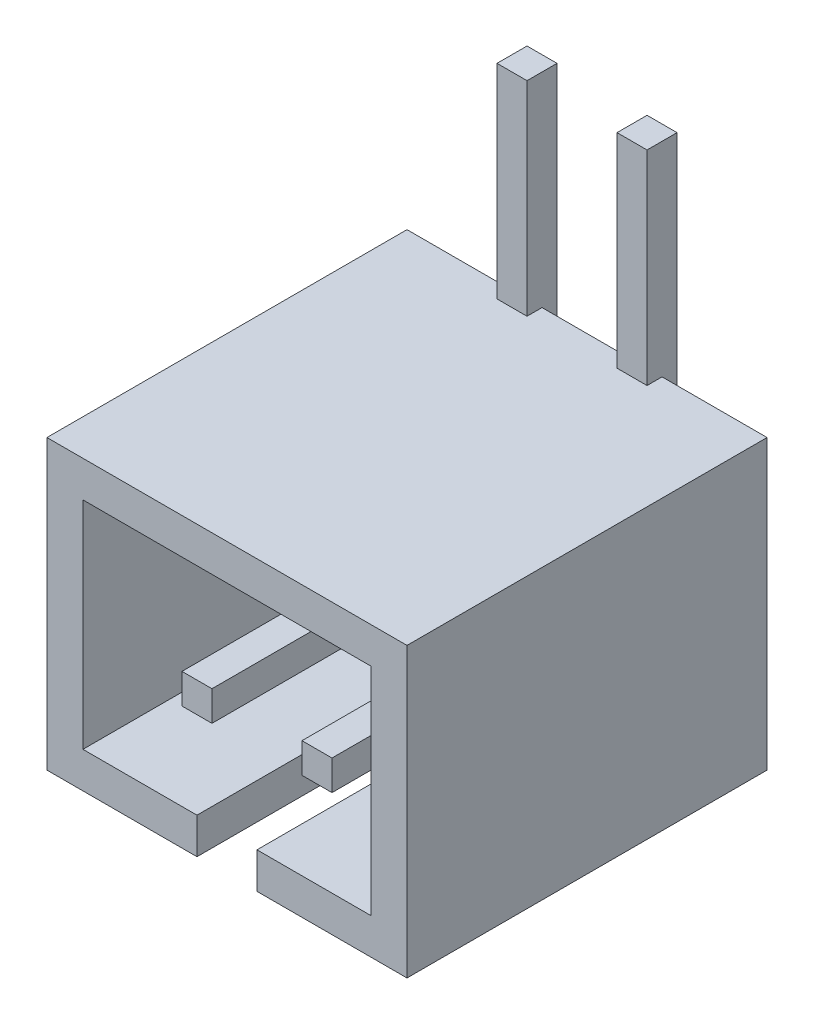
ISO-10303-21;
HEADER;
FILE_DESCRIPTION(('STEP AP214'),'2;1');
FILE_NAME('part.step','',(''),(''),'','','');
FILE_SCHEMA(('AUTOMOTIVE_DESIGN { 1 0 10303 214 1 1 1 1 }'));
ENDSEC;
DATA;
#1=APPLICATION_CONTEXT('core data for automotive mechanical design processes');
#2=APPLICATION_PROTOCOL_DEFINITION('international standard','automotive_design',2000,#1);
#3=PRODUCT_CONTEXT('',#1,'mechanical');
#4=PRODUCT('Part','Part','',(#3));
#5=PRODUCT_RELATED_PRODUCT_CATEGORY('part','',(#4));
#6=PRODUCT_DEFINITION_FORMATION('','',#4);
#7=PRODUCT_DEFINITION_CONTEXT('part definition',#1,'design');
#8=PRODUCT_DEFINITION('design','',#6,#7);
#9=PRODUCT_DEFINITION_SHAPE('','',#8);
#10=(LENGTH_UNIT() NAMED_UNIT(*) SI_UNIT(.MILLI.,.METRE.));
#11=(NAMED_UNIT(*) PLANE_ANGLE_UNIT() SI_UNIT($,.RADIAN.));
#12=(NAMED_UNIT(*) SI_UNIT($,.STERADIAN.) SOLID_ANGLE_UNIT());
#13=UNCERTAINTY_MEASURE_WITH_UNIT(LENGTH_MEASURE(1.E-05),#10,'distance_accuracy_value','');
#14=(GEOMETRIC_REPRESENTATION_CONTEXT(3) GLOBAL_UNCERTAINTY_ASSIGNED_CONTEXT((#13)) GLOBAL_UNIT_ASSIGNED_CONTEXT((#10,
#11,#12)) REPRESENTATION_CONTEXT('',''));
#15=CARTESIAN_POINT('',(0.,0.,0.));
#16=DIRECTION('',(0.,0.,1.));
#17=DIRECTION('',(1.,0.,0.));
#18=AXIS2_PLACEMENT_3D('',#15,#16,#17);
#19=CARTESIAN_POINT('',(-3.,2.4,2.));
#20=DIRECTION('',(0.,-1.,0.));
#21=DIRECTION('',(0.,0.,-1.));
#22=AXIS2_PLACEMENT_3D('',#19,#20,#21);
#23=PLANE('',#22);
#24=DIRECTION('',(0.,0.,1.));
#25=VECTOR('',#24,1.);
#26=CARTESIAN_POINT('',(0.75,2.4,2.));
#27=LINE('',#26,#25);
#28=CARTESIAN_POINT('',(0.75,2.4,0.));
#29=VERTEX_POINT('',#28);
#30=CARTESIAN_POINT('',(0.75,2.4,0.25));
#31=VERTEX_POINT('',#30);
#32=EDGE_CURVE('E292',#29,#31,#27,.T.);
#33=ORIENTED_EDGE('',*,*,#32,.F.);
#34=DIRECTION('',(-1.,0.,0.));
#35=VECTOR('',#34,1.);
#36=CARTESIAN_POINT('',(-3.,2.4,0.));
#37=LINE('',#36,#35);
#38=CARTESIAN_POINT('',(-0.75,2.4,0.));
#39=VERTEX_POINT('',#38);
#40=EDGE_CURVE('E502',#29,#39,#37,.T.);
#41=ORIENTED_EDGE('',*,*,#40,.T.);
#42=DIRECTION('',(0.,0.,1.));
#43=VECTOR('',#42,1.);
#44=CARTESIAN_POINT('',(-0.75,2.4,2.));
#45=LINE('',#44,#43);
#46=CARTESIAN_POINT('',(-0.75,2.4,0.25));
#47=VERTEX_POINT('',#46);
#48=EDGE_CURVE('E362',#39,#47,#45,.T.);
#49=ORIENTED_EDGE('',*,*,#48,.T.);
#50=DIRECTION('',(1.,0.,0.));
#51=VECTOR('',#50,1.);
#52=CARTESIAN_POINT('',(-3.,2.4,0.25));
#53=LINE('',#52,#51);
#54=CARTESIAN_POINT('',(-1.25,2.4,0.25));
#55=VERTEX_POINT('',#54);
#56=EDGE_CURVE('E535',#55,#47,#53,.T.);
#57=ORIENTED_EDGE('',*,*,#56,.F.);
#58=DIRECTION('',(0.,0.,1.));
#59=VECTOR('',#58,1.);
#60=CARTESIAN_POINT('',(-1.25,2.4,2.));
#61=LINE('',#60,#59);
#62=CARTESIAN_POINT('',(-1.25,2.4,0.));
#63=VERTEX_POINT('',#62);
#64=EDGE_CURVE('E370',#63,#55,#61,.T.);
#65=ORIENTED_EDGE('',*,*,#64,.F.);
#66=CARTESIAN_POINT('',(-3.,2.4,0.));
#67=VERTEX_POINT('',#66);
#68=EDGE_CURVE('E496',#63,#67,#37,.T.);
#69=ORIENTED_EDGE('',*,*,#68,.T.);
#70=DIRECTION('',(0.,0.,-1.));
#71=VECTOR('',#70,1.);
#72=CARTESIAN_POINT('',(-3.,2.4,2.));
#73=LINE('',#72,#71);
#74=CARTESIAN_POINT('',(-3.,2.4,6.));
#75=VERTEX_POINT('',#74);
#76=EDGE_CURVE('E514',#75,#67,#73,.T.);
#77=ORIENTED_EDGE('',*,*,#76,.F.);
#78=DIRECTION('',(-1.,0.,0.));
#79=VECTOR('',#78,1.);
#80=CARTESIAN_POINT('',(-3.,2.4,6.));
#81=LINE('',#80,#79);
#82=CARTESIAN_POINT('',(3.,2.4,6.));
#83=VERTEX_POINT('',#82);
#84=EDGE_CURVE('E415',#83,#75,#81,.T.);
#85=ORIENTED_EDGE('',*,*,#84,.F.);
#86=DIRECTION('',(0.,0.,-1.));
#87=VECTOR('',#86,1.);
#88=CARTESIAN_POINT('',(3.,2.4,2.));
#89=LINE('',#88,#87);
#90=CARTESIAN_POINT('',(3.,2.4,0.));
#91=VERTEX_POINT('',#90);
#92=EDGE_CURVE('E518',#83,#91,#89,.T.);
#93=ORIENTED_EDGE('',*,*,#92,.T.);
#94=CARTESIAN_POINT('',(1.25,2.4,0.));
#95=VERTEX_POINT('',#94);
#96=EDGE_CURVE('E497',#91,#95,#37,.T.);
#97=ORIENTED_EDGE('',*,*,#96,.T.);
#98=DIRECTION('',(0.,0.,1.));
#99=VECTOR('',#98,1.);
#100=CARTESIAN_POINT('',(1.25,2.4,2.));
#101=LINE('',#100,#99);
#102=CARTESIAN_POINT('',(1.25,2.4,0.25));
#103=VERTEX_POINT('',#102);
#104=EDGE_CURVE('E277',#95,#103,#101,.T.);
#105=ORIENTED_EDGE('',*,*,#104,.T.);
#106=DIRECTION('',(1.,0.,0.));
#107=VECTOR('',#106,1.);
#108=CARTESIAN_POINT('',(-3.,2.4,0.25));
#109=LINE('',#108,#107);
#110=EDGE_CURVE('E12',#31,#103,#109,.T.);
#111=ORIENTED_EDGE('',*,*,#110,.F.);
#112=EDGE_LOOP('',(#33,#41,#49,#57,#65,#69,#77,#85,#93,#97,#105,#111));
#113=FACE_BOUND('',#112,.T.);
#114=ADVANCED_FACE('F41',(#113),#23,.F.);
#115=CARTESIAN_POINT('',(0.,0.,2.));
#116=DIRECTION('',(0.,0.,1.));
#117=DIRECTION('',(1.,0.,0.));
#118=AXIS2_PLACEMENT_3D('',#115,#116,#117);
#119=PLANE('',#118);
#120=DIRECTION('',(0.,-1.,0.));
#121=VECTOR('',#120,1.);
#122=CARTESIAN_POINT('',(0.500000000000001,-2.4,2.));
#123=LINE('',#122,#121);
#124=CARTESIAN_POINT('',(0.500000000000001,-1.8,2.));
#125=VERTEX_POINT('',#124);
#126=CARTESIAN_POINT('',(0.500000000000001,-2.4,2.));
#127=VERTEX_POINT('',#126);
#128=EDGE_CURVE('E380',#125,#127,#123,.T.);
#129=ORIENTED_EDGE('',*,*,#128,.F.);
#130=DIRECTION('',(-1.,0.,0.));
#131=VECTOR('',#130,1.);
#132=CARTESIAN_POINT('',(0.500000000000001,-1.8,2.));
#133=LINE('',#132,#131);
#134=CARTESIAN_POINT('',(2.4,-1.8,2.));
#135=VERTEX_POINT('',#134);
#136=EDGE_CURVE('E386',#135,#125,#133,.T.);
#137=ORIENTED_EDGE('',*,*,#136,.F.);
#138=DIRECTION('',(0.,-1.,0.));
#139=VECTOR('',#138,1.);
#140=CARTESIAN_POINT('',(2.4,-1.8,2.));
#141=LINE('',#140,#139);
#142=CARTESIAN_POINT('',(2.4,1.8,2.));
#143=VERTEX_POINT('',#142);
#144=EDGE_CURVE('E391',#143,#135,#141,.T.);
#145=ORIENTED_EDGE('',*,*,#144,.F.);
#146=DIRECTION('',(1.,0.,0.));
#147=VECTOR('',#146,1.);
#148=CARTESIAN_POINT('',(-2.4,1.8,2.));
#149=LINE('',#148,#147);
#150=CARTESIAN_POINT('',(-2.4,1.8,2.));
#151=VERTEX_POINT('',#150);
#152=EDGE_CURVE('E396',#151,#143,#149,.T.);
#153=ORIENTED_EDGE('',*,*,#152,.F.);
#154=DIRECTION('',(0.,1.,0.));
#155=VECTOR('',#154,1.);
#156=CARTESIAN_POINT('',(-2.4,-1.8,2.));
#157=LINE('',#156,#155);
#158=CARTESIAN_POINT('',(-2.4,-1.8,2.));
#159=VERTEX_POINT('',#158);
#160=EDGE_CURVE('E401',#159,#151,#157,.T.);
#161=ORIENTED_EDGE('',*,*,#160,.F.);
#162=DIRECTION('',(-1.,0.,0.));
#163=VECTOR('',#162,1.);
#164=CARTESIAN_POINT('',(-0.5,-1.8,2.));
#165=LINE('',#164,#163);
#166=CARTESIAN_POINT('',(-0.5,-1.8,2.));
#167=VERTEX_POINT('',#166);
#168=EDGE_CURVE('E406',#167,#159,#165,.T.);
#169=ORIENTED_EDGE('',*,*,#168,.F.);
#170=DIRECTION('',(0.,1.,0.));
#171=VECTOR('',#170,1.);
#172=CARTESIAN_POINT('',(-0.5,-2.4,2.));
#173=LINE('',#172,#171);
#174=CARTESIAN_POINT('',(-0.5,-2.4,2.));
#175=VERTEX_POINT('',#174);
#176=EDGE_CURVE('E411',#175,#167,#173,.T.);
#177=ORIENTED_EDGE('',*,*,#176,.F.);
#178=DIRECTION('',(1.,0.,0.));
#179=VECTOR('',#178,1.);
#180=CARTESIAN_POINT('',(-3.,-2.4,2.));
#181=LINE('',#180,#179);
#182=EDGE_CURVE('E488',#175,#127,#181,.T.);
#183=ORIENTED_EDGE('',*,*,#182,.T.);
#184=EDGE_LOOP('',(#129,#137,#145,#153,#161,#169,#177,#183));
#185=FACE_BOUND('',#184,.T.);
#186=DIRECTION('',(-1.,0.,0.));
#187=VECTOR('',#186,1.);
#188=CARTESIAN_POINT('',(0.,-0.85,2.));
#189=LINE('',#188,#187);
#190=CARTESIAN_POINT('',(-0.75,-0.850000000000001,2.));
#191=VERTEX_POINT('',#190);
#192=CARTESIAN_POINT('',(-1.25,-0.850000000000001,2.));
#193=VERTEX_POINT('',#192);
#194=EDGE_CURVE('E376',#191,#193,#189,.T.);
#195=ORIENTED_EDGE('',*,*,#194,.T.);
#196=DIRECTION('',(0.,1.,0.));
#197=VECTOR('',#196,1.);
#198=CARTESIAN_POINT('',(-1.25,0.,2.));
#199=LINE('',#198,#197);
#200=CARTESIAN_POINT('',(-1.25,-0.349999999999999,2.));
#201=VERTEX_POINT('',#200);
#202=EDGE_CURVE('E373',#193,#201,#199,.T.);
#203=ORIENTED_EDGE('',*,*,#202,.T.);
#204=DIRECTION('',(1.,0.,0.));
#205=VECTOR('',#204,1.);
#206=CARTESIAN_POINT('',(0.,-0.349999999999999,2.));
#207=LINE('',#206,#205);
#208=CARTESIAN_POINT('',(-0.75,-0.349999999999999,2.));
#209=VERTEX_POINT('',#208);
#210=EDGE_CURVE('E532',#201,#209,#207,.T.);
#211=ORIENTED_EDGE('',*,*,#210,.T.);
#212=DIRECTION('',(0.,1.,0.));
#213=VECTOR('',#212,1.);
#214=CARTESIAN_POINT('',(-0.75,0.,2.));
#215=LINE('',#214,#213);
#216=EDGE_CURVE('E366',#191,#209,#215,.T.);
#217=ORIENTED_EDGE('',*,*,#216,.F.);
#218=EDGE_LOOP('',(#195,#203,#211,#217));
#219=FACE_BOUND('',#218,.T.);
#220=DIRECTION('',(-1.,0.,0.));
#221=VECTOR('',#220,1.);
#222=CARTESIAN_POINT('',(0.,-0.850000000000001,2.));
#223=LINE('',#222,#221);
#224=CARTESIAN_POINT('',(1.25,-0.850000000000001,2.));
#225=VERTEX_POINT('',#224);
#226=CARTESIAN_POINT('',(0.75,-0.850000000000001,2.));
#227=VERTEX_POINT('',#226);
#228=EDGE_CURVE('E57',#225,#227,#223,.T.);
#229=ORIENTED_EDGE('',*,*,#228,.T.);
#230=DIRECTION('',(0.,1.,0.));
#231=VECTOR('',#230,1.);
#232=CARTESIAN_POINT('',(0.75,0.,2.));
#233=LINE('',#232,#231);
#234=CARTESIAN_POINT('',(0.75,-0.349999999999999,2.));
#235=VERTEX_POINT('',#234);
#236=EDGE_CURVE('E61',#227,#235,#233,.T.);
#237=ORIENTED_EDGE('',*,*,#236,.T.);
#238=DIRECTION('',(1.,0.,0.));
#239=VECTOR('',#238,1.);
#240=CARTESIAN_POINT('',(0.,-0.349999999999999,2.));
#241=LINE('',#240,#239);
#242=CARTESIAN_POINT('',(1.25,-0.349999999999999,2.));
#243=VERTEX_POINT('',#242);
#244=EDGE_CURVE('E50',#235,#243,#241,.T.);
#245=ORIENTED_EDGE('',*,*,#244,.T.);
#246=DIRECTION('',(0.,1.,0.));
#247=VECTOR('',#246,1.);
#248=CARTESIAN_POINT('',(1.25,0.,2.));
#249=LINE('',#248,#247);
#250=EDGE_CURVE('E282',#225,#243,#249,.T.);
#251=ORIENTED_EDGE('',*,*,#250,.F.);
#252=EDGE_LOOP('',(#229,#237,#245,#251));
#253=FACE_BOUND('',#252,.T.);
#254=ADVANCED_FACE('F548',(#185,#219,#253),#119,.T.);
#255=CARTESIAN_POINT('',(0.,0.,0.));
#256=DIRECTION('',(0.,0.,1.));
#257=DIRECTION('',(1.,0.,0.));
#258=AXIS2_PLACEMENT_3D('',#255,#256,#257);
#259=PLANE('',#258);
#260=DIRECTION('',(0.,1.,0.));
#261=VECTOR('',#260,1.);
#262=CARTESIAN_POINT('',(0.75,0.,0.));
#263=LINE('',#262,#261);
#264=CARTESIAN_POINT('',(0.75,-0.850000000000001,0.));
#265=VERTEX_POINT('',#264);
#266=EDGE_CURVE('E545',#265,#29,#263,.T.);
#267=ORIENTED_EDGE('',*,*,#266,.F.);
#268=DIRECTION('',(-1.,0.,0.));
#269=VECTOR('',#268,1.);
#270=CARTESIAN_POINT('',(0.,-0.850000000000001,0.));
#271=LINE('',#270,#269);
#272=CARTESIAN_POINT('',(1.25,-0.850000000000001,0.));
#273=VERTEX_POINT('',#272);
#274=EDGE_CURVE('E542',#273,#265,#271,.T.);
#275=ORIENTED_EDGE('',*,*,#274,.F.);
#276=DIRECTION('',(0.,1.,0.));
#277=VECTOR('',#276,1.);
#278=CARTESIAN_POINT('',(1.25,0.,0.));
#279=LINE('',#278,#277);
#280=EDGE_CURVE('E538',#273,#95,#279,.T.);
#281=ORIENTED_EDGE('',*,*,#280,.T.);
#282=ORIENTED_EDGE('',*,*,#96,.F.);
#283=DIRECTION('',(0.,1.,0.));
#284=VECTOR('',#283,1.);
#285=CARTESIAN_POINT('',(3.,2.4,0.));
#286=LINE('',#285,#284);
#287=CARTESIAN_POINT('',(3.,-2.4,0.));
#288=VERTEX_POINT('',#287);
#289=EDGE_CURVE('E419',#288,#91,#286,.T.);
#290=ORIENTED_EDGE('',*,*,#289,.F.);
#291=DIRECTION('',(1.,0.,0.));
#292=VECTOR('',#291,1.);
#293=CARTESIAN_POINT('',(-3.,-2.4,0.));
#294=LINE('',#293,#292);
#295=CARTESIAN_POINT('',(-3.,-2.4,0.));
#296=VERTEX_POINT('',#295);
#297=EDGE_CURVE('E492',#296,#288,#294,.T.);
#298=ORIENTED_EDGE('',*,*,#297,.F.);
#299=DIRECTION('',(0.,-1.,0.));
#300=VECTOR('',#299,1.);
#301=CARTESIAN_POINT('',(-3.,2.4,0.));
#302=LINE('',#301,#300);
#303=EDGE_CURVE('E501',#67,#296,#302,.T.);
#304=ORIENTED_EDGE('',*,*,#303,.F.);
#305=ORIENTED_EDGE('',*,*,#68,.F.);
#306=DIRECTION('',(0.,1.,0.));
#307=VECTOR('',#306,1.);
#308=CARTESIAN_POINT('',(-1.25,0.,0.));
#309=LINE('',#308,#307);
#310=CARTESIAN_POINT('',(-1.25,-0.850000000000001,0.));
#311=VERTEX_POINT('',#310);
#312=EDGE_CURVE('E529',#311,#63,#309,.T.);
#313=ORIENTED_EDGE('',*,*,#312,.F.);
#314=DIRECTION('',(-1.,0.,0.));
#315=VECTOR('',#314,1.);
#316=CARTESIAN_POINT('',(0.,-0.850000000000001,0.));
#317=LINE('',#316,#315);
#318=CARTESIAN_POINT('',(-0.75,-0.850000000000001,0.));
#319=VERTEX_POINT('',#318);
#320=EDGE_CURVE('E526',#319,#311,#317,.T.);
#321=ORIENTED_EDGE('',*,*,#320,.F.);
#322=DIRECTION('',(0.,1.,0.));
#323=VECTOR('',#322,1.);
#324=CARTESIAN_POINT('',(-0.75,0.,0.));
#325=LINE('',#324,#323);
#326=EDGE_CURVE('E522',#319,#39,#325,.T.);
#327=ORIENTED_EDGE('',*,*,#326,.T.);
#328=ORIENTED_EDGE('',*,*,#40,.F.);
#329=EDGE_LOOP('',(#267,#275,#281,#282,#290,#298,#304,#305,#313,#321,#327,#328));
#330=FACE_BOUND('',#329,.T.);
#331=ADVANCED_FACE('F626',(#330),#259,.F.);
#332=CARTESIAN_POINT('',(3.,2.4,2.));
#333=DIRECTION('',(-1.,0.,0.));
#334=DIRECTION('',(0.,-1.,0.));
#335=AXIS2_PLACEMENT_3D('',#332,#333,#334);
#336=PLANE('',#335);
#337=ORIENTED_EDGE('',*,*,#289,.T.);
#338=ORIENTED_EDGE('',*,*,#92,.F.);
#339=DIRECTION('',(0.,1.,0.));
#340=VECTOR('',#339,1.);
#341=CARTESIAN_POINT('',(3.,-2.4,6.));
#342=LINE('',#341,#340);
#343=CARTESIAN_POINT('',(3.,-2.4,6.));
#344=VERTEX_POINT('',#343);
#345=EDGE_CURVE('E420',#344,#83,#342,.T.);
#346=ORIENTED_EDGE('',*,*,#345,.F.);
#347=DIRECTION('',(0.,0.,-1.));
#348=VECTOR('',#347,1.);
#349=CARTESIAN_POINT('',(3.,-2.4,2.));
#350=LINE('',#349,#348);
#351=EDGE_CURVE('E491',#344,#288,#350,.T.);
#352=ORIENTED_EDGE('',*,*,#351,.T.);
#353=EDGE_LOOP('',(#337,#338,#346,#352));
#354=FACE_BOUND('',#353,.T.);
#355=ADVANCED_FACE('F43',(#354),#336,.F.);
#356=CARTESIAN_POINT('',(-3.,2.4,2.));
#357=DIRECTION('',(1.,0.,0.));
#358=DIRECTION('',(0.,1.,0.));
#359=AXIS2_PLACEMENT_3D('',#356,#357,#358);
#360=PLANE('',#359);
#361=ORIENTED_EDGE('',*,*,#303,.T.);
#362=DIRECTION('',(0.,0.,-1.));
#363=VECTOR('',#362,1.);
#364=CARTESIAN_POINT('',(-3.,-2.4,2.));
#365=LINE('',#364,#363);
#366=CARTESIAN_POINT('',(-3.,-2.4,6.));
#367=VERTEX_POINT('',#366);
#368=EDGE_CURVE('E510',#367,#296,#365,.T.);
#369=ORIENTED_EDGE('',*,*,#368,.F.);
#370=DIRECTION('',(0.,-1.,0.));
#371=VECTOR('',#370,1.);
#372=CARTESIAN_POINT('',(-3.,-2.4,6.));
#373=LINE('',#372,#371);
#374=EDGE_CURVE('E460',#75,#367,#373,.T.);
#375=ORIENTED_EDGE('',*,*,#374,.F.);
#376=ORIENTED_EDGE('',*,*,#76,.T.);
#377=EDGE_LOOP('',(#361,#369,#375,#376));
#378=FACE_BOUND('',#377,.T.);
#379=ADVANCED_FACE('F631',(#378),#360,.F.);
#380=CARTESIAN_POINT('',(-3.,-2.4,2.));
#381=DIRECTION('',(0.,1.,0.));
#382=DIRECTION('',(0.,0.,1.));
#383=AXIS2_PLACEMENT_3D('',#380,#381,#382);
#384=PLANE('',#383);
#385=ORIENTED_EDGE('',*,*,#297,.T.);
#386=ORIENTED_EDGE('',*,*,#351,.F.);
#387=DIRECTION('',(1.,0.,0.));
#388=VECTOR('',#387,1.);
#389=CARTESIAN_POINT('',(0.500000000000001,-2.4,6.));
#390=LINE('',#389,#388);
#391=CARTESIAN_POINT('',(0.500000000000001,-2.4,6.));
#392=VERTEX_POINT('',#391);
#393=EDGE_CURVE('E424',#392,#344,#390,.T.);
#394=ORIENTED_EDGE('',*,*,#393,.F.);
#395=DIRECTION('',(0.,0.,-1.));
#396=VECTOR('',#395,1.);
#397=CARTESIAN_POINT('',(0.500000000000001,-2.4,19.6837490849194));
#398=LINE('',#397,#396);
#399=EDGE_CURVE('E384',#392,#127,#398,.T.);
#400=ORIENTED_EDGE('',*,*,#399,.T.);
#401=ORIENTED_EDGE('',*,*,#182,.F.);
#402=DIRECTION('',(0.,0.,-1.));
#403=VECTOR('',#402,1.);
#404=CARTESIAN_POINT('',(-0.5,-2.4,19.6837490849194));
#405=LINE('',#404,#403);
#406=CARTESIAN_POINT('',(-0.5,-2.4,6.));
#407=VERTEX_POINT('',#406);
#408=EDGE_CURVE('E379',#407,#175,#405,.T.);
#409=ORIENTED_EDGE('',*,*,#408,.F.);
#410=DIRECTION('',(1.,0.,0.));
#411=VECTOR('',#410,1.);
#412=CARTESIAN_POINT('',(-0.5,-2.4,6.));
#413=LINE('',#412,#411);
#414=EDGE_CURVE('E456',#367,#407,#413,.T.);
#415=ORIENTED_EDGE('',*,*,#414,.F.);
#416=ORIENTED_EDGE('',*,*,#368,.T.);
#417=EDGE_LOOP('',(#385,#386,#394,#400,#401,#409,#415,#416));
#418=FACE_BOUND('',#417,.T.);
#419=ADVANCED_FACE('F634',(#418),#384,.F.);
#420=CARTESIAN_POINT('',(-0.5,-2.4,19.6837490849194));
#421=DIRECTION('',(-1.,0.,0.));
#422=DIRECTION('',(0.,0.,1.));
#423=AXIS2_PLACEMENT_3D('',#420,#421,#422);
#424=PLANE('',#423);
#425=DIRECTION('',(0.,1.,0.));
#426=VECTOR('',#425,1.);
#427=CARTESIAN_POINT('',(-0.5,-2.4,6.));
#428=LINE('',#427,#426);
#429=CARTESIAN_POINT('',(-0.5,-1.8,6.));
#430=VERTEX_POINT('',#429);
#431=EDGE_CURVE('E452',#407,#430,#428,.T.);
#432=ORIENTED_EDGE('',*,*,#431,.F.);
#433=ORIENTED_EDGE('',*,*,#408,.T.);
#434=ORIENTED_EDGE('',*,*,#176,.T.);
#435=DIRECTION('',(0.,0.,-1.));
#436=VECTOR('',#435,1.);
#437=CARTESIAN_POINT('',(-0.5,-1.8,19.6837490849194));
#438=LINE('',#437,#436);
#439=EDGE_CURVE('E410',#430,#167,#438,.T.);
#440=ORIENTED_EDGE('',*,*,#439,.F.);
#441=EDGE_LOOP('',(#432,#433,#434,#440));
#442=FACE_BOUND('',#441,.T.);
#443=ADVANCED_FACE('F638',(#442),#424,.F.);
#444=CARTESIAN_POINT('',(-0.5,-1.8,19.6837490849194));
#445=DIRECTION('',(0.,-1.,0.));
#446=DIRECTION('',(1.,0.,0.));
#447=AXIS2_PLACEMENT_3D('',#444,#445,#446);
#448=PLANE('',#447);
#449=DIRECTION('',(-1.,0.,0.));
#450=VECTOR('',#449,1.);
#451=CARTESIAN_POINT('',(-0.5,-1.8,6.));
#452=LINE('',#451,#450);
#453=CARTESIAN_POINT('',(-2.4,-1.8,6.));
#454=VERTEX_POINT('',#453);
#455=EDGE_CURVE('E448',#430,#454,#452,.T.);
#456=ORIENTED_EDGE('',*,*,#455,.F.);
#457=ORIENTED_EDGE('',*,*,#439,.T.);
#458=ORIENTED_EDGE('',*,*,#168,.T.);
#459=DIRECTION('',(0.,0.,-1.));
#460=VECTOR('',#459,1.);
#461=CARTESIAN_POINT('',(-2.4,-1.8,19.6837490849194));
#462=LINE('',#461,#460);
#463=EDGE_CURVE('E405',#454,#159,#462,.T.);
#464=ORIENTED_EDGE('',*,*,#463,.F.);
#465=EDGE_LOOP('',(#456,#457,#458,#464));
#466=FACE_BOUND('',#465,.T.);
#467=ADVANCED_FACE('F651',(#466),#448,.F.);
#468=CARTESIAN_POINT('',(-2.4,-1.8,19.6837490849194));
#469=DIRECTION('',(-1.,0.,0.));
#470=DIRECTION('',(0.,0.,1.));
#471=AXIS2_PLACEMENT_3D('',#468,#469,#470);
#472=PLANE('',#471);
#473=DIRECTION('',(0.,1.,0.));
#474=VECTOR('',#473,1.);
#475=CARTESIAN_POINT('',(-2.4,-1.8,6.));
#476=LINE('',#475,#474);
#477=CARTESIAN_POINT('',(-2.4,1.8,6.));
#478=VERTEX_POINT('',#477);
#479=EDGE_CURVE('E444',#454,#478,#476,.T.);
#480=ORIENTED_EDGE('',*,*,#479,.F.);
#481=ORIENTED_EDGE('',*,*,#463,.T.);
#482=ORIENTED_EDGE('',*,*,#160,.T.);
#483=DIRECTION('',(0.,0.,-1.));
#484=VECTOR('',#483,1.);
#485=CARTESIAN_POINT('',(-2.4,1.8,19.6837490849194));
#486=LINE('',#485,#484);
#487=EDGE_CURVE('E400',#478,#151,#486,.T.);
#488=ORIENTED_EDGE('',*,*,#487,.F.);
#489=EDGE_LOOP('',(#480,#481,#482,#488));
#490=FACE_BOUND('',#489,.T.);
#491=ADVANCED_FACE('F655',(#490),#472,.F.);
#492=CARTESIAN_POINT('',(-2.4,1.8,19.6837490849194));
#493=DIRECTION('',(0.,1.,0.));
#494=DIRECTION('',(-1.,0.,0.));
#495=AXIS2_PLACEMENT_3D('',#492,#493,#494);
#496=PLANE('',#495);
#497=DIRECTION('',(1.,0.,0.));
#498=VECTOR('',#497,1.);
#499=CARTESIAN_POINT('',(-2.4,1.8,6.));
#500=LINE('',#499,#498);
#501=CARTESIAN_POINT('',(2.4,1.8,6.));
#502=VERTEX_POINT('',#501);
#503=EDGE_CURVE('E440',#478,#502,#500,.T.);
#504=ORIENTED_EDGE('',*,*,#503,.F.);
#505=ORIENTED_EDGE('',*,*,#487,.T.);
#506=ORIENTED_EDGE('',*,*,#152,.T.);
#507=DIRECTION('',(0.,0.,-1.));
#508=VECTOR('',#507,1.);
#509=CARTESIAN_POINT('',(2.4,1.8,19.6837490849194));
#510=LINE('',#509,#508);
#511=EDGE_CURVE('E395',#502,#143,#510,.T.);
#512=ORIENTED_EDGE('',*,*,#511,.F.);
#513=EDGE_LOOP('',(#504,#505,#506,#512));
#514=FACE_BOUND('',#513,.T.);
#515=ADVANCED_FACE('F659',(#514),#496,.F.);
#516=CARTESIAN_POINT('',(2.4,-1.8,19.6837490849194));
#517=DIRECTION('',(1.,0.,0.));
#518=DIRECTION('',(0.,1.,0.));
#519=AXIS2_PLACEMENT_3D('',#516,#517,#518);
#520=PLANE('',#519);
#521=DIRECTION('',(0.,-1.,0.));
#522=VECTOR('',#521,1.);
#523=CARTESIAN_POINT('',(2.4,-1.8,6.));
#524=LINE('',#523,#522);
#525=CARTESIAN_POINT('',(2.4,-1.8,6.));
#526=VERTEX_POINT('',#525);
#527=EDGE_CURVE('E436',#502,#526,#524,.T.);
#528=ORIENTED_EDGE('',*,*,#527,.F.);
#529=ORIENTED_EDGE('',*,*,#511,.T.);
#530=ORIENTED_EDGE('',*,*,#144,.T.);
#531=DIRECTION('',(0.,0.,-1.));
#532=VECTOR('',#531,1.);
#533=CARTESIAN_POINT('',(2.4,-1.8,19.6837490849194));
#534=LINE('',#533,#532);
#535=EDGE_CURVE('E390',#526,#135,#534,.T.);
#536=ORIENTED_EDGE('',*,*,#535,.F.);
#537=EDGE_LOOP('',(#528,#529,#530,#536));
#538=FACE_BOUND('',#537,.T.);
#539=ADVANCED_FACE('F663',(#538),#520,.F.);
#540=CARTESIAN_POINT('',(0.500000000000001,-1.8,19.6837490849194));
#541=DIRECTION('',(0.,-1.,0.));
#542=DIRECTION('',(1.,0.,0.));
#543=AXIS2_PLACEMENT_3D('',#540,#541,#542);
#544=PLANE('',#543);
#545=DIRECTION('',(-1.,0.,0.));
#546=VECTOR('',#545,1.);
#547=CARTESIAN_POINT('',(0.500000000000001,-1.8,6.));
#548=LINE('',#547,#546);
#549=CARTESIAN_POINT('',(0.500000000000001,-1.8,6.));
#550=VERTEX_POINT('',#549);
#551=EDGE_CURVE('E432',#526,#550,#548,.T.);
#552=ORIENTED_EDGE('',*,*,#551,.F.);
#553=ORIENTED_EDGE('',*,*,#535,.T.);
#554=ORIENTED_EDGE('',*,*,#136,.T.);
#555=DIRECTION('',(0.,0.,-1.));
#556=VECTOR('',#555,1.);
#557=CARTESIAN_POINT('',(0.500000000000001,-1.8,19.6837490849194));
#558=LINE('',#557,#556);
#559=EDGE_CURVE('E385',#550,#125,#558,.T.);
#560=ORIENTED_EDGE('',*,*,#559,.F.);
#561=EDGE_LOOP('',(#552,#553,#554,#560));
#562=FACE_BOUND('',#561,.T.);
#563=ADVANCED_FACE('F667',(#562),#544,.F.);
#564=CARTESIAN_POINT('',(0.500000000000001,-2.4,19.6837490849194));
#565=DIRECTION('',(1.,0.,0.));
#566=DIRECTION('',(0.,1.,0.));
#567=AXIS2_PLACEMENT_3D('',#564,#565,#566);
#568=PLANE('',#567);
#569=DIRECTION('',(0.,-1.,0.));
#570=VECTOR('',#569,1.);
#571=CARTESIAN_POINT('',(0.500000000000001,-2.4,6.));
#572=LINE('',#571,#570);
#573=EDGE_CURVE('E428',#550,#392,#572,.T.);
#574=ORIENTED_EDGE('',*,*,#573,.F.);
#575=ORIENTED_EDGE('',*,*,#559,.T.);
#576=ORIENTED_EDGE('',*,*,#128,.T.);
#577=ORIENTED_EDGE('',*,*,#399,.F.);
#578=EDGE_LOOP('',(#574,#575,#576,#577));
#579=FACE_BOUND('',#578,.T.);
#580=ADVANCED_FACE('F647',(#579),#568,.F.);
#581=CARTESIAN_POINT('',(0.,0.,6.));
#582=DIRECTION('',(0.,0.,1.));
#583=DIRECTION('',(1.,0.,0.));
#584=AXIS2_PLACEMENT_3D('',#581,#582,#583);
#585=PLANE('',#584);
#586=ORIENTED_EDGE('',*,*,#374,.T.);
#587=ORIENTED_EDGE('',*,*,#414,.T.);
#588=ORIENTED_EDGE('',*,*,#431,.T.);
#589=ORIENTED_EDGE('',*,*,#455,.T.);
#590=ORIENTED_EDGE('',*,*,#479,.T.);
#591=ORIENTED_EDGE('',*,*,#503,.T.);
#592=ORIENTED_EDGE('',*,*,#527,.T.);
#593=ORIENTED_EDGE('',*,*,#551,.T.);
#594=ORIENTED_EDGE('',*,*,#573,.T.);
#595=ORIENTED_EDGE('',*,*,#393,.T.);
#596=ORIENTED_EDGE('',*,*,#345,.T.);
#597=ORIENTED_EDGE('',*,*,#84,.T.);
#598=EDGE_LOOP('',(#586,#587,#588,#589,#590,#591,#592,#593,#594,#595,#596,#597));
#599=FACE_BOUND('',#598,.T.);
#600=ADVANCED_FACE('F643',(#599),#585,.T.);
#601=CARTESIAN_POINT('',(-1.25,5.8,-0.25));
#602=DIRECTION('',(0.,-1.,0.));
#603=DIRECTION('',(1.,0.,0.));
#604=AXIS2_PLACEMENT_3D('',#601,#602,#603);
#605=PLANE('',#604);
#606=DIRECTION('',(0.,0.,-1.));
#607=VECTOR('',#606,1.);
#608=CARTESIAN_POINT('',(-0.750000000000001,5.8,-0.25));
#609=LINE('',#608,#607);
#610=CARTESIAN_POINT('',(-0.750000000000001,5.8,0.25));
#611=VERTEX_POINT('',#610);
#612=CARTESIAN_POINT('',(-0.750000000000001,5.8,-0.25));
#613=VERTEX_POINT('',#612);
#614=EDGE_CURVE('E299',#611,#613,#609,.T.);
#615=ORIENTED_EDGE('',*,*,#614,.T.);
#616=DIRECTION('',(1.,0.,0.));
#617=VECTOR('',#616,1.);
#618=CARTESIAN_POINT('',(-1.25,5.8,-0.25));
#619=LINE('',#618,#617);
#620=CARTESIAN_POINT('',(-1.25,5.8,-0.25));
#621=VERTEX_POINT('',#620);
#622=EDGE_CURVE('E358',#621,#613,#619,.T.);
#623=ORIENTED_EDGE('',*,*,#622,.F.);
#624=DIRECTION('',(0.,0.,-1.));
#625=VECTOR('',#624,1.);
#626=CARTESIAN_POINT('',(-1.25,5.8,-0.25));
#627=LINE('',#626,#625);
#628=CARTESIAN_POINT('',(-1.25,5.8,0.25));
#629=VERTEX_POINT('',#628);
#630=EDGE_CURVE('E300',#629,#621,#627,.T.);
#631=ORIENTED_EDGE('',*,*,#630,.F.);
#632=DIRECTION('',(1.,0.,0.));
#633=VECTOR('',#632,1.);
#634=CARTESIAN_POINT('',(-1.25,5.8,0.25));
#635=LINE('',#634,#633);
#636=EDGE_CURVE('E323',#629,#611,#635,.T.);
#637=ORIENTED_EDGE('',*,*,#636,.T.);
#638=EDGE_LOOP('',(#615,#623,#631,#637));
#639=FACE_BOUND('',#638,.T.);
#640=ADVANCED_FACE('F646',(#639),#605,.F.);
#641=CARTESIAN_POINT('',(-1.25,-0.850000000000001,-0.25));
#642=DIRECTION('',(0.,0.,1.));
#643=DIRECTION('',(0.,-1.,0.));
#644=AXIS2_PLACEMENT_3D('',#641,#642,#643);
#645=PLANE('',#644);
#646=DIRECTION('',(0.,-1.,0.));
#647=VECTOR('',#646,1.);
#648=CARTESIAN_POINT('',(-0.75,-0.850000000000001,-0.25));
#649=LINE('',#648,#647);
#650=CARTESIAN_POINT('',(-0.75,-0.850000000000001,-0.25));
#651=VERTEX_POINT('',#650);
#652=EDGE_CURVE('E327',#613,#651,#649,.T.);
#653=ORIENTED_EDGE('',*,*,#652,.T.);
#654=DIRECTION('',(1.,0.,0.));
#655=VECTOR('',#654,1.);
#656=CARTESIAN_POINT('',(-1.25,-0.850000000000001,-0.25));
#657=LINE('',#656,#655);
#658=CARTESIAN_POINT('',(-1.25,-0.850000000000001,-0.25));
#659=VERTEX_POINT('',#658);
#660=EDGE_CURVE('E354',#659,#651,#657,.T.);
#661=ORIENTED_EDGE('',*,*,#660,.F.);
#662=DIRECTION('',(0.,-1.,0.));
#663=VECTOR('',#662,1.);
#664=CARTESIAN_POINT('',(-1.25,-0.850000000000001,-0.25));
#665=LINE('',#664,#663);
#666=EDGE_CURVE('E304',#621,#659,#665,.T.);
#667=ORIENTED_EDGE('',*,*,#666,.F.);
#668=ORIENTED_EDGE('',*,*,#622,.T.);
#669=EDGE_LOOP('',(#653,#661,#667,#668));
#670=FACE_BOUND('',#669,.T.);
#671=ADVANCED_FACE('F677',(#670),#645,.F.);
#672=CARTESIAN_POINT('',(-1.25,0.,0.));
#673=DIRECTION('',(1.,0.,0.));
#674=DIRECTION('',(0.,1.,0.));
#675=AXIS2_PLACEMENT_3D('',#672,#673,#674);
#676=PLANE('',#675);
#677=ORIENTED_EDGE('',*,*,#312,.T.);
#678=ORIENTED_EDGE('',*,*,#64,.T.);
#679=DIRECTION('',(0.,1.,0.));
#680=VECTOR('',#679,1.);
#681=CARTESIAN_POINT('',(-1.25,5.8,0.25));
#682=LINE('',#681,#680);
#683=EDGE_CURVE('E320',#55,#629,#682,.T.);
#684=ORIENTED_EDGE('',*,*,#683,.T.);
#685=ORIENTED_EDGE('',*,*,#630,.T.);
#686=ORIENTED_EDGE('',*,*,#666,.T.);
#687=DIRECTION('',(0.,0.,1.));
#688=VECTOR('',#687,1.);
#689=CARTESIAN_POINT('',(-1.25,-0.849999999999999,5.5));
#690=LINE('',#689,#688);
#691=EDGE_CURVE('E309',#659,#311,#690,.T.);
#692=ORIENTED_EDGE('',*,*,#691,.T.);
#693=EDGE_LOOP('',(#677,#678,#684,#685,#686,#692));
#694=FACE_BOUND('',#693,.T.);
#695=ADVANCED_FACE('F681',(#694),#676,.F.);
#696=CARTESIAN_POINT('',(-0.75,0.,0.));
#697=DIRECTION('',(1.,0.,0.));
#698=DIRECTION('',(0.,1.,0.));
#699=AXIS2_PLACEMENT_3D('',#696,#697,#698);
#700=PLANE('',#699);
#701=ORIENTED_EDGE('',*,*,#48,.F.);
#702=ORIENTED_EDGE('',*,*,#326,.F.);
#703=DIRECTION('',(0.,0.,1.));
#704=VECTOR('',#703,1.);
#705=CARTESIAN_POINT('',(-0.75,-0.849999999999999,5.5));
#706=LINE('',#705,#704);
#707=EDGE_CURVE('E331',#651,#319,#706,.T.);
#708=ORIENTED_EDGE('',*,*,#707,.F.);
#709=ORIENTED_EDGE('',*,*,#652,.F.);
#710=ORIENTED_EDGE('',*,*,#614,.F.);
#711=DIRECTION('',(0.,1.,0.));
#712=VECTOR('',#711,1.);
#713=CARTESIAN_POINT('',(-0.750000000000001,5.8,0.25));
#714=LINE('',#713,#712);
#715=EDGE_CURVE('E305',#47,#611,#714,.T.);
#716=ORIENTED_EDGE('',*,*,#715,.F.);
#717=EDGE_LOOP('',(#701,#702,#708,#709,#710,#716));
#718=FACE_BOUND('',#717,.T.);
#719=ADVANCED_FACE('F705',(#718),#700,.T.);
#720=CARTESIAN_POINT('',(-1.25,-0.849999999999999,5.5));
#721=DIRECTION('',(0.,1.,0.));
#722=DIRECTION('',(0.,0.,1.));
#723=AXIS2_PLACEMENT_3D('',#720,#721,#722);
#724=PLANE('',#723);
#725=ORIENTED_EDGE('',*,*,#707,.T.);
#726=ORIENTED_EDGE('',*,*,#320,.T.);
#727=ORIENTED_EDGE('',*,*,#691,.F.);
#728=ORIENTED_EDGE('',*,*,#660,.T.);
#729=EDGE_LOOP('',(#725,#726,#727,#728));
#730=FACE_BOUND('',#729,.T.);
#731=ADVANCED_FACE('F689',(#730),#724,.F.);
#732=CARTESIAN_POINT('',(-1.25,5.8,0.25));
#733=DIRECTION('',(0.,0.,-1.));
#734=DIRECTION('',(0.,1.,0.));
#735=AXIS2_PLACEMENT_3D('',#732,#733,#734);
#736=PLANE('',#735);
#737=ORIENTED_EDGE('',*,*,#683,.F.);
#738=ORIENTED_EDGE('',*,*,#56,.T.);
#739=ORIENTED_EDGE('',*,*,#715,.T.);
#740=ORIENTED_EDGE('',*,*,#636,.F.);
#741=EDGE_LOOP('',(#737,#738,#739,#740));
#742=FACE_BOUND('',#741,.T.);
#743=ADVANCED_FACE('F687',(#742),#736,.F.);
#744=ORIENTED_EDGE('',*,*,#194,.F.);
#745=CARTESIAN_POINT('',(-0.75,-0.849999999999999,5.5));
#746=VERTEX_POINT('',#745);
#747=EDGE_CURVE('E330',#191,#746,#706,.T.);
#748=ORIENTED_EDGE('',*,*,#747,.T.);
#749=DIRECTION('',(1.,0.,0.));
#750=VECTOR('',#749,1.);
#751=CARTESIAN_POINT('',(-1.25,-0.849999999999999,5.5));
#752=LINE('',#751,#750);
#753=CARTESIAN_POINT('',(-1.25,-0.849999999999999,5.5));
#754=VERTEX_POINT('',#753);
#755=EDGE_CURVE('E350',#754,#746,#752,.T.);
#756=ORIENTED_EDGE('',*,*,#755,.F.);
#757=EDGE_CURVE('E308',#193,#754,#690,.T.);
#758=ORIENTED_EDGE('',*,*,#757,.F.);
#759=EDGE_LOOP('',(#744,#748,#756,#758));
#760=FACE_BOUND('',#759,.T.);
#761=ADVANCED_FACE('F683',(#760),#724,.F.);
#762=CARTESIAN_POINT('',(-1.25,-0.349999999999999,5.5));
#763=DIRECTION('',(0.,0.,-1.));
#764=DIRECTION('',(-1.,0.,0.));
#765=AXIS2_PLACEMENT_3D('',#762,#763,#764);
#766=PLANE('',#765);
#767=DIRECTION('',(0.,1.,0.));
#768=VECTOR('',#767,1.);
#769=CARTESIAN_POINT('',(-0.75,-0.349999999999999,5.5));
#770=LINE('',#769,#768);
#771=CARTESIAN_POINT('',(-0.75,-0.349999999999999,5.5));
#772=VERTEX_POINT('',#771);
#773=EDGE_CURVE('E335',#746,#772,#770,.T.);
#774=ORIENTED_EDGE('',*,*,#773,.T.);
#775=DIRECTION('',(1.,0.,0.));
#776=VECTOR('',#775,1.);
#777=CARTESIAN_POINT('',(-1.25,-0.349999999999999,5.5));
#778=LINE('',#777,#776);
#779=CARTESIAN_POINT('',(-1.25,-0.349999999999999,5.5));
#780=VERTEX_POINT('',#779);
#781=EDGE_CURVE('E346',#780,#772,#778,.T.);
#782=ORIENTED_EDGE('',*,*,#781,.F.);
#783=DIRECTION('',(0.,1.,0.));
#784=VECTOR('',#783,1.);
#785=CARTESIAN_POINT('',(-1.25,-0.349999999999999,5.5));
#786=LINE('',#785,#784);
#787=EDGE_CURVE('E313',#754,#780,#786,.T.);
#788=ORIENTED_EDGE('',*,*,#787,.F.);
#789=ORIENTED_EDGE('',*,*,#755,.T.);
#790=EDGE_LOOP('',(#774,#782,#788,#789));
#791=FACE_BOUND('',#790,.T.);
#792=ADVANCED_FACE('F686',(#791),#766,.F.);
#793=CARTESIAN_POINT('',(-1.25,-0.349999999999999,0.250000000000001));
#794=DIRECTION('',(0.,-1.,0.));
#795=DIRECTION('',(1.,0.,0.));
#796=AXIS2_PLACEMENT_3D('',#793,#794,#795);
#797=PLANE('',#796);
#798=ORIENTED_EDGE('',*,*,#210,.F.);
#799=DIRECTION('',(0.,0.,-1.));
#800=VECTOR('',#799,1.);
#801=CARTESIAN_POINT('',(-1.25,-0.349999999999999,0.250000000000001));
#802=LINE('',#801,#800);
#803=EDGE_CURVE('E316',#780,#201,#802,.T.);
#804=ORIENTED_EDGE('',*,*,#803,.F.);
#805=ORIENTED_EDGE('',*,*,#781,.T.);
#806=DIRECTION('',(0.,0.,-1.));
#807=VECTOR('',#806,1.);
#808=CARTESIAN_POINT('',(-0.75,-0.349999999999999,0.250000000000001));
#809=LINE('',#808,#807);
#810=EDGE_CURVE('E337',#772,#209,#809,.T.);
#811=ORIENTED_EDGE('',*,*,#810,.T.);
#812=EDGE_LOOP('',(#798,#804,#805,#811));
#813=FACE_BOUND('',#812,.T.);
#814=ADVANCED_FACE('F692',(#813),#797,.F.);
#815=ORIENTED_EDGE('',*,*,#202,.F.);
#816=ORIENTED_EDGE('',*,*,#757,.T.);
#817=ORIENTED_EDGE('',*,*,#787,.T.);
#818=ORIENTED_EDGE('',*,*,#803,.T.);
#819=EDGE_LOOP('',(#815,#816,#817,#818));
#820=FACE_BOUND('',#819,.T.);
#821=ADVANCED_FACE('F696',(#820),#676,.F.);
#822=ORIENTED_EDGE('',*,*,#747,.F.);
#823=ORIENTED_EDGE('',*,*,#216,.T.);
#824=ORIENTED_EDGE('',*,*,#810,.F.);
#825=ORIENTED_EDGE('',*,*,#773,.F.);
#826=EDGE_LOOP('',(#822,#823,#824,#825));
#827=FACE_BOUND('',#826,.T.);
#828=ADVANCED_FACE('F701',(#827),#700,.T.);
#829=CARTESIAN_POINT('',(0.749999999999999,5.8,-0.25));
#830=DIRECTION('',(0.,-1.,0.));
#831=DIRECTION('',(1.,0.,0.));
#832=AXIS2_PLACEMENT_3D('',#829,#830,#831);
#833=PLANE('',#832);
#834=DIRECTION('',(0.,0.,-1.));
#835=VECTOR('',#834,1.);
#836=CARTESIAN_POINT('',(1.25,5.8,-0.25));
#837=LINE('',#836,#835);
#838=CARTESIAN_POINT('',(1.25,5.8,0.25));
#839=VERTEX_POINT('',#838);
#840=CARTESIAN_POINT('',(1.25,5.8,-0.25));
#841=VERTEX_POINT('',#840);
#842=EDGE_CURVE('E275',#839,#841,#837,.T.);
#843=ORIENTED_EDGE('',*,*,#842,.T.);
#844=DIRECTION('',(1.,0.,0.));
#845=VECTOR('',#844,1.);
#846=CARTESIAN_POINT('',(0.749999999999999,5.8,-0.25));
#847=LINE('',#846,#845);
#848=CARTESIAN_POINT('',(0.749999999999999,5.8,-0.25));
#849=VERTEX_POINT('',#848);
#850=EDGE_CURVE('E252',#849,#841,#847,.T.);
#851=ORIENTED_EDGE('',*,*,#850,.F.);
#852=DIRECTION('',(0.,0.,-1.));
#853=VECTOR('',#852,1.);
#854=CARTESIAN_POINT('',(0.749999999999999,5.8,-0.25));
#855=LINE('',#854,#853);
#856=CARTESIAN_POINT('',(0.749999999999999,5.8,0.25));
#857=VERTEX_POINT('',#856);
#858=EDGE_CURVE('E261',#857,#849,#855,.T.);
#859=ORIENTED_EDGE('',*,*,#858,.F.);
#860=DIRECTION('',(1.,0.,0.));
#861=VECTOR('',#860,1.);
#862=CARTESIAN_POINT('',(0.749999999999999,5.8,0.25));
#863=LINE('',#862,#861);
#864=EDGE_CURVE('E574',#857,#839,#863,.T.);
#865=ORIENTED_EDGE('',*,*,#864,.T.);
#866=EDGE_LOOP('',(#843,#851,#859,#865));
#867=FACE_BOUND('',#866,.T.);
#868=ADVANCED_FACE('F273',(#867),#833,.F.);
#869=CARTESIAN_POINT('',(0.75,-0.850000000000001,-0.25));
#870=DIRECTION('',(0.,0.,1.));
#871=DIRECTION('',(0.,-1.,0.));
#872=AXIS2_PLACEMENT_3D('',#869,#870,#871);
#873=PLANE('',#872);
#874=DIRECTION('',(0.,-1.,0.));
#875=VECTOR('',#874,1.);
#876=CARTESIAN_POINT('',(1.25,-0.850000000000001,-0.25));
#877=LINE('',#876,#875);
#878=CARTESIAN_POINT('',(1.25,-0.850000000000001,-0.25));
#879=VERTEX_POINT('',#878);
#880=EDGE_CURVE('E590',#841,#879,#877,.T.);
#881=ORIENTED_EDGE('',*,*,#880,.T.);
#882=DIRECTION('',(1.,0.,0.));
#883=VECTOR('',#882,1.);
#884=CARTESIAN_POINT('',(0.75,-0.850000000000001,-0.25));
#885=LINE('',#884,#883);
#886=CARTESIAN_POINT('',(0.75,-0.850000000000001,-0.25));
#887=VERTEX_POINT('',#886);
#888=EDGE_CURVE('E255',#887,#879,#885,.T.);
#889=ORIENTED_EDGE('',*,*,#888,.F.);
#890=DIRECTION('',(0.,-1.,0.));
#891=VECTOR('',#890,1.);
#892=CARTESIAN_POINT('',(0.75,-0.850000000000001,-0.25));
#893=LINE('',#892,#891);
#894=EDGE_CURVE('E248',#849,#887,#893,.T.);
#895=ORIENTED_EDGE('',*,*,#894,.F.);
#896=ORIENTED_EDGE('',*,*,#850,.T.);
#897=EDGE_LOOP('',(#881,#889,#895,#896));
#898=FACE_BOUND('',#897,.T.);
#899=ADVANCED_FACE('F250',(#898),#873,.F.);
#900=CARTESIAN_POINT('',(0.75,0.,0.));
#901=DIRECTION('',(1.,0.,0.));
#902=DIRECTION('',(0.,1.,0.));
#903=AXIS2_PLACEMENT_3D('',#900,#901,#902);
#904=PLANE('',#903);
#905=ORIENTED_EDGE('',*,*,#266,.T.);
#906=ORIENTED_EDGE('',*,*,#32,.T.);
#907=DIRECTION('',(0.,1.,0.));
#908=VECTOR('',#907,1.);
#909=CARTESIAN_POINT('',(0.749999999999999,5.8,0.25));
#910=LINE('',#909,#908);
#911=EDGE_CURVE('E266',#31,#857,#910,.T.);
#912=ORIENTED_EDGE('',*,*,#911,.T.);
#913=ORIENTED_EDGE('',*,*,#858,.T.);
#914=ORIENTED_EDGE('',*,*,#894,.T.);
#915=DIRECTION('',(0.,0.,1.));
#916=VECTOR('',#915,1.);
#917=CARTESIAN_POINT('',(0.75,-0.849999999999999,5.5));
#918=LINE('',#917,#916);
#919=EDGE_CURVE('E605',#887,#265,#918,.T.);
#920=ORIENTED_EDGE('',*,*,#919,.T.);
#921=EDGE_LOOP('',(#905,#906,#912,#913,#914,#920));
#922=FACE_BOUND('',#921,.T.);
#923=ADVANCED_FACE('F264',(#922),#904,.F.);
#924=CARTESIAN_POINT('',(1.25,0.,0.));
#925=DIRECTION('',(1.,0.,0.));
#926=DIRECTION('',(0.,1.,0.));
#927=AXIS2_PLACEMENT_3D('',#924,#925,#926);
#928=PLANE('',#927);
#929=ORIENTED_EDGE('',*,*,#104,.F.);
#930=ORIENTED_EDGE('',*,*,#280,.F.);
#931=DIRECTION('',(0.,0.,1.));
#932=VECTOR('',#931,1.);
#933=CARTESIAN_POINT('',(1.25,-0.849999999999999,5.5));
#934=LINE('',#933,#932);
#935=EDGE_CURVE('E570',#879,#273,#934,.T.);
#936=ORIENTED_EDGE('',*,*,#935,.F.);
#937=ORIENTED_EDGE('',*,*,#880,.F.);
#938=ORIENTED_EDGE('',*,*,#842,.F.);
#939=DIRECTION('',(0.,1.,0.));
#940=VECTOR('',#939,1.);
#941=CARTESIAN_POINT('',(1.25,5.8,0.25));
#942=LINE('',#941,#940);
#943=EDGE_CURVE('E271',#103,#839,#942,.T.);
#944=ORIENTED_EDGE('',*,*,#943,.F.);
#945=EDGE_LOOP('',(#929,#930,#936,#937,#938,#944));
#946=FACE_BOUND('',#945,.T.);
#947=ADVANCED_FACE('F618',(#946),#928,.T.);
#948=CARTESIAN_POINT('',(0.75,-0.849999999999999,5.5));
#949=DIRECTION('',(0.,1.,0.));
#950=DIRECTION('',(0.,0.,1.));
#951=AXIS2_PLACEMENT_3D('',#948,#949,#950);
#952=PLANE('',#951);
#953=ORIENTED_EDGE('',*,*,#935,.T.);
#954=ORIENTED_EDGE('',*,*,#274,.T.);
#955=ORIENTED_EDGE('',*,*,#919,.F.);
#956=ORIENTED_EDGE('',*,*,#888,.T.);
#957=EDGE_LOOP('',(#953,#954,#955,#956));
#958=FACE_BOUND('',#957,.T.);
#959=ADVANCED_FACE('F716',(#958),#952,.F.);
#960=CARTESIAN_POINT('',(0.749999999999999,5.8,0.25));
#961=DIRECTION('',(0.,0.,-1.));
#962=DIRECTION('',(0.,1.,0.));
#963=AXIS2_PLACEMENT_3D('',#960,#961,#962);
#964=PLANE('',#963);
#965=ORIENTED_EDGE('',*,*,#911,.F.);
#966=ORIENTED_EDGE('',*,*,#110,.T.);
#967=ORIENTED_EDGE('',*,*,#943,.T.);
#968=ORIENTED_EDGE('',*,*,#864,.F.);
#969=EDGE_LOOP('',(#965,#966,#967,#968));
#970=FACE_BOUND('',#969,.T.);
#971=ADVANCED_FACE('F715',(#970),#964,.F.);
#972=ORIENTED_EDGE('',*,*,#228,.F.);
#973=CARTESIAN_POINT('',(1.25,-0.849999999999999,5.5));
#974=VERTEX_POINT('',#973);
#975=EDGE_CURVE('E559',#225,#974,#934,.T.);
#976=ORIENTED_EDGE('',*,*,#975,.T.);
#977=DIRECTION('',(1.,0.,0.));
#978=VECTOR('',#977,1.);
#979=CARTESIAN_POINT('',(0.75,-0.849999999999999,5.5));
#980=LINE('',#979,#978);
#981=CARTESIAN_POINT('',(0.75,-0.849999999999999,5.5));
#982=VERTEX_POINT('',#981);
#983=EDGE_CURVE('E285',#982,#974,#980,.T.);
#984=ORIENTED_EDGE('',*,*,#983,.F.);
#985=EDGE_CURVE('E260',#227,#982,#918,.T.);
#986=ORIENTED_EDGE('',*,*,#985,.F.);
#987=EDGE_LOOP('',(#972,#976,#984,#986));
#988=FACE_BOUND('',#987,.T.);
#989=ADVANCED_FACE('F588',(#988),#952,.F.);
#990=CARTESIAN_POINT('',(0.75,-0.349999999999999,5.5));
#991=DIRECTION('',(0.,0.,-1.));
#992=DIRECTION('',(-1.,0.,0.));
#993=AXIS2_PLACEMENT_3D('',#990,#991,#992);
#994=PLANE('',#993);
#995=DIRECTION('',(0.,1.,0.));
#996=VECTOR('',#995,1.);
#997=CARTESIAN_POINT('',(1.25,-0.349999999999999,5.5));
#998=LINE('',#997,#996);
#999=CARTESIAN_POINT('',(1.25,-0.349999999999999,5.5));
#1000=VERTEX_POINT('',#999);
#1001=EDGE_CURVE('E565',#974,#1000,#998,.T.);
#1002=ORIENTED_EDGE('',*,*,#1001,.T.);
#1003=DIRECTION('',(1.,0.,0.));
#1004=VECTOR('',#1003,1.);
#1005=CARTESIAN_POINT('',(0.75,-0.349999999999999,5.5));
#1006=LINE('',#1005,#1004);
#1007=CARTESIAN_POINT('',(0.75,-0.349999999999999,5.5));
#1008=VERTEX_POINT('',#1007);
#1009=EDGE_CURVE('E563',#1008,#1000,#1006,.T.);
#1010=ORIENTED_EDGE('',*,*,#1009,.F.);
#1011=DIRECTION('',(0.,1.,0.));
#1012=VECTOR('',#1011,1.);
#1013=CARTESIAN_POINT('',(0.75,-0.349999999999999,5.5));
#1014=LINE('',#1013,#1012);
#1015=EDGE_CURVE('E585',#982,#1008,#1014,.T.);
#1016=ORIENTED_EDGE('',*,*,#1015,.F.);
#1017=ORIENTED_EDGE('',*,*,#983,.T.);
#1018=EDGE_LOOP('',(#1002,#1010,#1016,#1017));
#1019=FACE_BOUND('',#1018,.T.);
#1020=ADVANCED_FACE('F584',(#1019),#994,.F.);
#1021=CARTESIAN_POINT('',(0.75,-0.349999999999999,0.250000000000001));
#1022=DIRECTION('',(0.,-1.,0.));
#1023=DIRECTION('',(1.,0.,0.));
#1024=AXIS2_PLACEMENT_3D('',#1021,#1022,#1023);
#1025=PLANE('',#1024);
#1026=ORIENTED_EDGE('',*,*,#244,.F.);
#1027=DIRECTION('',(0.,0.,-1.));
#1028=VECTOR('',#1027,1.);
#1029=CARTESIAN_POINT('',(0.75,-0.349999999999999,0.250000000000001));
#1030=LINE('',#1029,#1028);
#1031=EDGE_CURVE('E600',#1008,#235,#1030,.T.);
#1032=ORIENTED_EDGE('',*,*,#1031,.F.);
#1033=ORIENTED_EDGE('',*,*,#1009,.T.);
#1034=DIRECTION('',(0.,0.,-1.));
#1035=VECTOR('',#1034,1.);
#1036=CARTESIAN_POINT('',(1.25,-0.349999999999999,0.250000000000001));
#1037=LINE('',#1036,#1035);
#1038=EDGE_CURVE('E558',#1000,#243,#1037,.T.);
#1039=ORIENTED_EDGE('',*,*,#1038,.T.);
#1040=EDGE_LOOP('',(#1026,#1032,#1033,#1039));
#1041=FACE_BOUND('',#1040,.T.);
#1042=ADVANCED_FACE('F561',(#1041),#1025,.F.);
#1043=ORIENTED_EDGE('',*,*,#236,.F.);
#1044=ORIENTED_EDGE('',*,*,#985,.T.);
#1045=ORIENTED_EDGE('',*,*,#1015,.T.);
#1046=ORIENTED_EDGE('',*,*,#1031,.T.);
#1047=EDGE_LOOP('',(#1043,#1044,#1045,#1046));
#1048=FACE_BOUND('',#1047,.T.);
#1049=ADVANCED_FACE('F610',(#1048),#904,.F.);
#1050=ORIENTED_EDGE('',*,*,#975,.F.);
#1051=ORIENTED_EDGE('',*,*,#250,.T.);
#1052=ORIENTED_EDGE('',*,*,#1038,.F.);
#1053=ORIENTED_EDGE('',*,*,#1001,.F.);
#1054=EDGE_LOOP('',(#1050,#1051,#1052,#1053));
#1055=FACE_BOUND('',#1054,.T.);
#1056=ADVANCED_FACE('F556',(#1055),#928,.T.);
#1057=CLOSED_SHELL('',(#114,#254,#331,#355,#379,#419,#443,#467,#491,#515,#539,#563,#580,#600,
#640,#671,#695,#719,#731,#743,#761,#792,#814,#821,#828,#868,#899,#923,#947,#959,#971,#989,#1020,
#1042,#1049,#1056));
#1058=MANIFOLD_SOLID_BREP('B2',#1057);
#1059=ADVANCED_BREP_SHAPE_REPRESENTATION('',(#18,#1058),#14);
#1060=SHAPE_DEFINITION_REPRESENTATION(#9,#1059);
ENDSEC;
END-ISO-10303-21;
